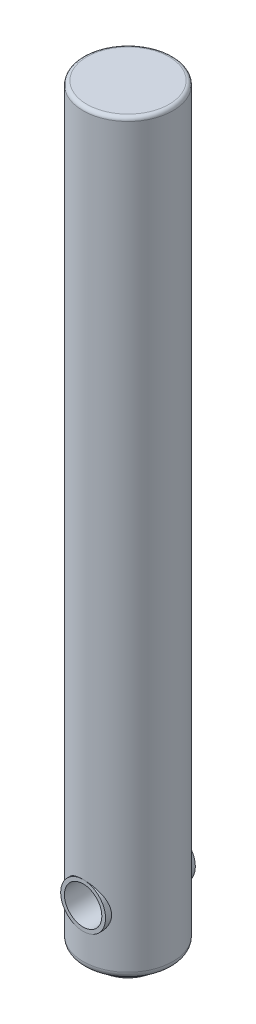
ISO-10303-21;
HEADER;
FILE_DESCRIPTION(('STEP AP214'),'2;1');
FILE_NAME('part.step','',(''),(''),'','','');
FILE_SCHEMA(('AUTOMOTIVE_DESIGN { 1 0 10303 214 1 1 1 1 }'));
ENDSEC;
DATA;
#1=APPLICATION_CONTEXT('core data for automotive mechanical design processes');
#2=APPLICATION_PROTOCOL_DEFINITION('international standard','automotive_design',2000,#1);
#3=PRODUCT_CONTEXT('',#1,'mechanical');
#4=PRODUCT('Part','Part','',(#3));
#5=PRODUCT_RELATED_PRODUCT_CATEGORY('part','',(#4));
#6=PRODUCT_DEFINITION_FORMATION('','',#4);
#7=PRODUCT_DEFINITION_CONTEXT('part definition',#1,'design');
#8=PRODUCT_DEFINITION('design','',#6,#7);
#9=PRODUCT_DEFINITION_SHAPE('','',#8);
#10=(LENGTH_UNIT() NAMED_UNIT(*) SI_UNIT(.MILLI.,.METRE.));
#11=(NAMED_UNIT(*) PLANE_ANGLE_UNIT() SI_UNIT($,.RADIAN.));
#12=(NAMED_UNIT(*) SI_UNIT($,.STERADIAN.) SOLID_ANGLE_UNIT());
#13=UNCERTAINTY_MEASURE_WITH_UNIT(LENGTH_MEASURE(1.E-05),#10,'distance_accuracy_value','');
#14=(GEOMETRIC_REPRESENTATION_CONTEXT(3) GLOBAL_UNCERTAINTY_ASSIGNED_CONTEXT((#13)) GLOBAL_UNIT_ASSIGNED_CONTEXT((#10,
#11,#12)) REPRESENTATION_CONTEXT('',''));
#15=CARTESIAN_POINT('',(0.,0.,0.));
#16=DIRECTION('',(0.,0.,1.));
#17=DIRECTION('',(1.,0.,0.));
#18=AXIS2_PLACEMENT_3D('',#15,#16,#17);
#19=CARTESIAN_POINT('',(0.,200.,0.));
#20=DIRECTION('',(0.,-1.,0.));
#21=DIRECTION('',(0.,0.,-1.));
#22=AXIS2_PLACEMENT_3D('',#19,#20,#21);
#23=CYLINDRICAL_SURFACE('',#22,12.);
#24=CARTESIAN_POINT('',(0.,199.,0.));
#25=DIRECTION('',(0.,1.,0.));
#26=DIRECTION('',(0.,0.,1.));
#27=AXIS2_PLACEMENT_3D('',#24,#25,#26);
#28=CIRCLE('',#27,12.);
#29=CARTESIAN_POINT('',(0.,199.,12.));
#30=VERTEX_POINT('',#29);
#31=EDGE_CURVE('E11',#30,#30,#28,.F.);
#32=ORIENTED_EDGE('',*,*,#31,.T.);
#33=EDGE_LOOP('',(#32));
#34=FACE_BOUND('',#33,.T.);
#35=CARTESIAN_POINT('',(0.,2.,0.));
#36=DIRECTION('',(0.,1.,0.));
#37=DIRECTION('',(0.,0.,1.));
#38=AXIS2_PLACEMENT_3D('',#35,#36,#37);
#39=CIRCLE('',#38,12.);
#40=CARTESIAN_POINT('',(0.,2.,12.));
#41=VERTEX_POINT('',#40);
#42=EDGE_CURVE('E118',#41,#41,#39,.T.);
#43=ORIENTED_EDGE('',*,*,#42,.T.);
#44=EDGE_LOOP('',(#43));
#45=FACE_BOUND('',#44,.T.);
#46=CARTESIAN_POINT('',(0.,21.,-12.));
#47=CARTESIAN_POINT('',(-0.15778665750659,20.9999994729223,-11.999999517333));
#48=CARTESIAN_POINT('',(-0.315584362390745,20.9937686657008,-11.9968806357414));
#49=CARTESIAN_POINT('',(-0.630017505488314,20.9689165310243,-11.9844837357367));
#50=CARTESIAN_POINT('',(-0.786652408091074,20.950289813296,-11.9752030379058));
#51=CARTESIAN_POINT('',(-1.09773984723465,20.9008310572039,-11.9507048014984));
#52=CARTESIAN_POINT('',(-1.25218894477724,20.869981612968,-11.9354787969095));
#53=CARTESIAN_POINT('',(-1.55763162669136,20.7964192186789,-11.899472605728));
#54=CARTESIAN_POINT('',(-1.70862377104804,20.753701418725,-11.8786901486704));
#55=CARTESIAN_POINT('',(-2.00545669311594,20.6570657258618,-11.8321851368608));
#56=CARTESIAN_POINT('',(-2.15131699081467,20.6031972673143,-11.8064844230278));
#57=CARTESIAN_POINT('',(-2.43773317125829,20.4846617971933,-11.7506932229282));
#58=CARTESIAN_POINT('',(-2.57828703310104,20.4199907214134,-11.7206010850419));
#59=CARTESIAN_POINT('',(-2.9906722413852,20.2106378016774,-11.6247696320651));
#60=CARTESIAN_POINT('',(-3.25355436812248,20.0505086372506,-11.5534217342428));
#61=CARTESIAN_POINT('',(-3.76508783734944,19.6828889706445,-11.3973719786279));
#62=CARTESIAN_POINT('',(-4.011916106714,19.4731192832976,-11.3121233680264));
#63=CARTESIAN_POINT('',(-4.46869184071481,19.0168329368505,-11.1395867857715));
#64=CARTESIAN_POINT('',(-4.67861120056694,18.7702885369187,-11.052297316888));
#65=CARTESIAN_POINT('',(-4.96965764340833,18.3664482319131,-10.9231409611172));
#66=CARTESIAN_POINT('',(-5.06557168476816,18.2203491833003,-10.8788710330199));
#67=CARTESIAN_POINT('',(-5.24464654593473,17.9196345353008,-10.7936784259666));
#68=CARTESIAN_POINT('',(-5.32781276827762,17.765022581661,-10.7527543324936));
#69=CARTESIAN_POINT('',(-5.48065335185335,17.4481396191338,-10.6756627859445));
#70=CARTESIAN_POINT('',(-5.55032854738167,17.2858690846313,-10.6394950387766));
#71=CARTESIAN_POINT('',(-5.67539334483848,16.9547874711191,-10.5733116591534));
#72=CARTESIAN_POINT('',(-5.73079140497155,16.7859803330947,-10.5432923863307));
#73=CARTESIAN_POINT('',(-5.82376390163365,16.4532113952768,-10.4922076496055));
#74=CARTESIAN_POINT('',(-5.86220067382683,16.289556147351,-10.4707166907288));
#75=CARTESIAN_POINT('',(-5.92527136019382,15.9588884400843,-10.4351557632392));
#76=CARTESIAN_POINT('',(-5.94991259763506,15.7918778107954,-10.4210818575664));
#77=CARTESIAN_POINT('',(-5.98502866078839,15.4559912401471,-10.4009539976217));
#78=CARTESIAN_POINT('',(-5.99551201814884,15.2871164840433,-10.3948952134206));
#79=CARTESIAN_POINT('',(-6.00216482773377,14.9489985368372,-10.3910555784398));
#80=CARTESIAN_POINT('',(-5.9983356456294,14.7797553824266,-10.3932739378732));
#81=CARTESIAN_POINT('',(-5.97774962961665,14.4627557239952,-10.4051247299039));
#82=CARTESIAN_POINT('',(-5.96259849844362,14.3148568796959,-10.4138359630376));
#83=CARTESIAN_POINT('',(-5.92145283395669,14.0210145401703,-10.4372868829351));
#84=CARTESIAN_POINT('',(-5.89545489495947,13.87507167395,-10.4520284630803));
#85=CARTESIAN_POINT('',(-5.83291533897245,13.5861625516483,-10.4870577551983));
#86=CARTESIAN_POINT('',(-5.796375023719,13.4431959304057,-10.5073447824221));
#87=CARTESIAN_POINT('',(-5.7131318300676,13.1610343474289,-10.5528368877399));
#88=CARTESIAN_POINT('',(-5.66642495833423,13.0218408919894,-10.5780438979576));
#89=CARTESIAN_POINT('',(-5.50930393619581,12.6047917542198,-10.6612323891138));
#90=CARTESIAN_POINT('',(-5.38330542988224,12.3339679727981,-10.7259455020169));
#91=CARTESIAN_POINT('',(-5.09423509206158,11.816147858089,-10.8662091969286));
#92=CARTESIAN_POINT('',(-4.93114660816762,11.5691622986771,-10.941764641208));
#93=CARTESIAN_POINT('',(-4.54841306771565,11.0728937661688,-11.1067854691139));
#94=CARTESIAN_POINT('',(-4.32421885971531,10.8272903907529,-11.19679985044));
#95=CARTESIAN_POINT('',(-3.83728133811826,10.3755558411719,-11.3728681669182));
#96=CARTESIAN_POINT('',(-3.57451970663576,10.1694435314215,-11.4589201944648));
#97=CARTESIAN_POINT('',(-3.1491672011915,9.88987092346063,-11.5804140789891));
#98=CARTESIAN_POINT('',(-2.99845202805221,9.79997748581405,-11.620444563298));
#99=CARTESIAN_POINT('',(-2.68885272169301,9.63335015644472,-11.6959566326146));
#100=CARTESIAN_POINT('',(-2.52997206899903,9.55661071733304,-11.7314401336039));
#101=CARTESIAN_POINT('',(-2.20515363984366,9.4171213494976,-11.796810642152));
#102=CARTESIAN_POINT('',(-2.03921873643215,9.35436578921243,-11.826699901834));
#103=CARTESIAN_POINT('',(-1.70149425450703,9.24357008526185,-11.8799883173954));
#104=CARTESIAN_POINT('',(-1.52970535202999,9.19552824877026,-11.9033882198513));
#105=CARTESIAN_POINT('',(-1.19615761935544,9.11815972325563,-11.9413151682626));
#106=CARTESIAN_POINT('',(-1.0347464118509,9.08761257957787,-11.956416557175));
#107=CARTESIAN_POINT('',(-0.709498028988244,9.03983035246897,-11.980116427625));
#108=CARTESIAN_POINT('',(-0.545661069388974,9.02259409226307,-11.9887154840127));
#109=CARTESIAN_POINT('',(-0.216972862468056,9.00166419835052,-11.9991645701724));
#110=CARTESIAN_POINT('',(-0.0521220276819344,8.99796537998723,-12.0010171837393));
#111=CARTESIAN_POINT('',(0.277257172214853,9.00414671559377,-11.9979268381775));
#112=CARTESIAN_POINT('',(0.441785551273996,9.01402626861392,-11.992984179793));
#113=CARTESIAN_POINT('',(0.756388684583027,9.04593431607277,-11.9770917324992));
#114=CARTESIAN_POINT('',(0.906591982753162,9.06695772022474,-11.9666392666057));
#115=CARTESIAN_POINT('',(1.20456563233119,9.12020970134662,-11.9403265284468));
#116=CARTESIAN_POINT('',(1.35233519758663,9.15244182742274,-11.9244645433534));
#117=CARTESIAN_POINT('',(1.64438575428244,9.22776198072708,-11.8877101482599));
#118=CARTESIAN_POINT('',(1.78866779847568,9.27084668595717,-11.8668192776993));
#119=CARTESIAN_POINT('',(2.07298257233464,9.36747841901584,-11.8204696431794));
#120=CARTESIAN_POINT('',(2.21301365040652,9.42102945463087,-11.7950091297101));
#121=CARTESIAN_POINT('',(2.49189624030328,9.53977490960353,-11.7393028015628));
#122=CARTESIAN_POINT('',(2.63060339081931,9.60525483857787,-11.7089423848929));
#123=CARTESIAN_POINT('',(2.90198094402243,9.74624711719641,-11.6446549954643));
#124=CARTESIAN_POINT('',(3.03464912246201,9.82176312378188,-11.6107267235974));
#125=CARTESIAN_POINT('',(3.42262651921551,10.0625741696082,-11.5046658949123));
#126=CARTESIAN_POINT('',(3.66805794640021,10.2421963229906,-11.4282262974126));
#127=CARTESIAN_POINT('',(4.15064329035224,10.654571869757,-11.2624878293664));
#128=CARTESIAN_POINT('',(4.3846175451149,10.8908106291793,-11.1726633057385));
#129=CARTESIAN_POINT('',(4.81115285762436,11.3995975205787,-10.9957332695664));
#130=CARTESIAN_POINT('',(5.0036852666756,11.6721705609547,-10.9086296733302));
#131=CARTESIAN_POINT('',(5.26159500383475,12.1109915972481,-10.7854222397218));
#132=CARTESIAN_POINT('',(5.34392396170295,12.266225787631,-10.7447501998903));
#133=CARTESIAN_POINT('',(5.49501896116917,12.584277503554,-10.6682672504455));
#134=CARTESIAN_POINT('',(5.56379154045446,12.7470913266846,-10.632454000247));
#135=CARTESIAN_POINT('',(5.68696809582943,13.0791324916116,-10.5670839096235));
#136=CARTESIAN_POINT('',(5.74138360588706,13.2483545594889,-10.5375220508625));
#137=CARTESIAN_POINT('',(5.83518002342334,13.5920292388028,-10.4858738342513));
#138=CARTESIAN_POINT('',(5.87456325877644,13.7664810358553,-10.4637863189961));
#139=CARTESIAN_POINT('',(5.93464549962821,14.1021150485129,-10.4298156032619));
#140=CARTESIAN_POINT('',(5.95677515741596,14.2629635377784,-10.4171563888611));
#141=CARTESIAN_POINT('',(5.98792614324689,14.5863363106116,-10.399282087544));
#142=CARTESIAN_POINT('',(5.99694836276266,14.7488604794546,-10.3940664943671));
#143=CARTESIAN_POINT('',(6.0017457309024,15.0741083106821,-10.39129710714));
#144=CARTESIAN_POINT('',(5.99752577925852,15.2368318770154,-10.3937404791976));
#145=CARTESIAN_POINT('',(5.97591568312032,15.5611026735415,-10.4061801831484));
#146=CARTESIAN_POINT('',(5.95852607778567,15.7226499516177,-10.4161762058393));
#147=CARTESIAN_POINT('',(5.91311736162768,16.0278705738329,-10.4420137994047));
#148=CARTESIAN_POINT('',(5.8862738904068,16.1717757337559,-10.4572048845609));
#149=CARTESIAN_POINT('',(5.82233328291582,16.4566302618556,-10.4929387440244));
#150=CARTESIAN_POINT('',(5.78523274221134,16.5975786319006,-10.5134832950758));
#151=CARTESIAN_POINT('',(5.65908430450414,17.0147001559654,-10.5822506400165));
#152=CARTESIAN_POINT('',(5.55515995912644,17.2853452149275,-10.6376249866544));
#153=CARTESIAN_POINT('',(5.30288229290565,17.8237946508565,-10.7657155223649));
#154=CARTESIAN_POINT('',(5.15201309583076,18.0901865172672,-10.8393468768705));
#155=CARTESIAN_POINT('',(4.81291956804656,18.5956281008334,-10.9941163631343));
#156=CARTESIAN_POINT('',(4.62467580306306,18.8346634906172,-11.0752583885738));
#157=CARTESIAN_POINT('',(4.18917198682791,19.3088865402848,-11.2477510970766));
#158=CARTESIAN_POINT('',(3.93752026690748,19.5400775742369,-11.3391442276818));
#159=CARTESIAN_POINT('',(3.53209733214223,19.8532025669049,-11.4692892104779));
#160=CARTESIAN_POINT('',(3.39216916282729,19.9520363073581,-11.5115460678003));
#161=CARTESIAN_POINT('',(3.10368746347901,20.137752923716,-11.5926493680118));
#162=CARTESIAN_POINT('',(2.95513790564797,20.2246412421351,-11.6314973610929));
#163=CARTESIAN_POINT('',(2.64908199116111,20.3863304962342,-11.705013109218));
#164=CARTESIAN_POINT('',(2.49151563532489,20.4610335306701,-11.739646488167));
#165=CARTESIAN_POINT('',(2.16958487964698,20.5967303484265,-11.8033809723761));
#166=CARTESIAN_POINT('',(2.00522386671555,20.6577308667177,-11.8324847943983));
#167=CARTESIAN_POINT('',(1.67123654305269,20.7652126680381,-11.8842527340049));
#168=CARTESIAN_POINT('',(1.50162261994211,20.8117256182699,-11.906930886991));
#169=CARTESIAN_POINT('',(1.15828397558868,20.8897656085357,-11.945215702731));
#170=CARTESIAN_POINT('',(0.984561833748138,20.9213018027539,-11.9608266848506));
#171=CARTESIAN_POINT('',(0.675650105814743,20.9633693498498,-11.9817166032964));
#172=CARTESIAN_POINT('',(0.540991004079837,20.9770940804863,-11.9885608853928));
#173=CARTESIAN_POINT('',(0.270890662855613,20.995409757845,-11.9977028536597));
#174=CARTESIAN_POINT('',(0.135449401881627,21.0000004524614,-12.0000004143376));
#175=CARTESIAN_POINT('',(0.,21.,-12.));
#176=B_SPLINE_CURVE_WITH_KNOTS('',3,(#46,#47,#48,#49,#50,#51,#52,#53,#54,#55,#56,#57,#58,#59,
#60,#61,#62,#63,#64,#65,#66,#67,#68,#69,#70,#71,#72,#73,#74,#75,#76,#77,#78,#79,#80,#81,#82,#83,
#84,#85,#86,#87,#88,#89,#90,#91,#92,#93,#94,#95,#96,#97,#98,#99,#100,#101,#102,#103,#104,#105,
#106,#107,#108,#109,#110,#111,#112,#113,#114,#115,#116,#117,#118,#119,#120,#121,#122,#123,#124,
#125,#126,#127,#128,#129,#130,#131,#132,#133,#134,#135,#136,#137,#138,#139,#140,#141,#142,#143,
#144,#145,#146,#147,#148,#149,#150,#151,#152,#153,#154,#155,#156,#157,#158,#159,#160,#161,#162,
#163,#164,#165,#166,#167,#168,#169,#170,#171,#172,#173,#174,#175),.UNSPECIFIED.,.T.,.F.,(4,2,2,
2,2,2,2,2,2,2,2,2,2,2,2,2,2,2,2,2,2,2,2,2,2,2,2,2,2,2,2,2,2,2,2,2,2,2,2,2,2,2,2,2,2,2,2,2,2,2,2,
2,2,2,2,2,2,2,2,2,2,2,2,2,4),(0.,0.473226353579866,0.946658620845379,1.42076752042832,
1.89507044618031,2.36731402236651,2.83973566985558,3.78354530039119,4.78445328921032,
5.786120162826,6.32642118596971,6.86649259220192,7.40653058932848,7.94624791240663,
8.45395033294239,8.96138298687526,9.46850972130813,9.97558806805501,10.4218446882245,
10.868241529725,11.3145832752512,11.7611006573465,12.674026831915,13.5873636974191,
14.6165089018385,15.646144497727,16.1855259709471,16.724679410078,17.2636153283551,
17.8024892182932,18.2967339523968,18.7909349868218,19.2849467291347,19.7789366082479,
20.2344903466114,20.6901884620942,21.1457472565439,21.6014808373907,22.0700530070643,
22.5387963853797,23.4757920686062,24.5048016623547,25.5345203406166,26.0749950935823,
26.6152085565286,27.1549867002174,27.6946812207644,28.1825688461441,28.6704232874037,
29.1580972390615,29.6457512266466,30.0867670068204,30.5279293410885,31.4096652534582,
32.3506409329744,33.292107194775,34.3479680915645,34.8767898811921,35.4053699274536,
35.9380073127865,36.4703823240418,37.0015853583519,37.5324632882878,37.9386855790538,
38.3449190816828),.UNSPECIFIED.);
#177=CARTESIAN_POINT('',(0.,9.,-12.));
#178=VERTEX_POINT('',#177);
#179=CARTESIAN_POINT('',(0.,21.,-12.));
#180=VERTEX_POINT('',#179);
#181=EDGE_CURVE('E78',#178,#180,#176,.T.);
#182=ORIENTED_EDGE('',*,*,#181,.T.);
#183=EDGE_CURVE('E80',#180,#178,#176,.T.);
#184=ORIENTED_EDGE('',*,*,#183,.T.);
#185=EDGE_LOOP('',(#182,#184));
#186=FACE_BOUND('',#185,.T.);
#187=CARTESIAN_POINT('',(6.,15.,10.3923048454133));
#188=CARTESIAN_POINT('',(5.99999932875804,14.8436021552913,10.392305741369));
#189=CARTESIAN_POINT('',(5.99387675624553,14.6871906948031,10.39584745739));
#190=CARTESIAN_POINT('',(5.96946677329013,14.3755731530049,10.4098828015151));
#191=CARTESIAN_POINT('',(5.95117369948805,14.2203676669088,10.4203796660835));
#192=CARTESIAN_POINT('',(5.90262923828191,13.9121859557094,10.447954141523));
#193=CARTESIAN_POINT('',(5.8723590974293,13.7592136185881,10.4650420714895));
#194=CARTESIAN_POINT('',(5.80022662043492,13.4567708159041,10.5051926116526));
#195=CARTESIAN_POINT('',(5.75835924341967,13.3073019038577,10.5282578196609));
#196=CARTESIAN_POINT('',(5.663772314443,13.0137156916186,10.5794400850423));
#197=CARTESIAN_POINT('',(5.61111714169721,12.8695723712196,10.607527052553));
#198=CARTESIAN_POINT('',(5.49530086331669,12.5864779020686,10.6679865511427));
#199=CARTESIAN_POINT('',(5.4321356919844,12.447528788222,10.7003607397011));
#200=CARTESIAN_POINT('',(5.22766532232496,12.0396108510837,10.802532596744));
#201=CARTESIAN_POINT('',(5.07129480406256,11.7792936359453,10.8774308638826));
#202=CARTESIAN_POINT('',(4.70799231550122,11.2661256446182,11.0398177990442));
#203=CARTESIAN_POINT('',(4.49795386813279,11.0156615224013,11.1278353936549));
#204=CARTESIAN_POINT('',(4.03948117371046,10.5515333249958,11.3023273959528));
#205=CARTESIAN_POINT('',(3.79102789078169,10.3378876061909,11.3888010147197));
#206=CARTESIAN_POINT('',(3.38439787953913,10.0425266354713,11.5138135690253));
#207=CARTESIAN_POINT('',(3.23805814579229,9.94570377541614,11.5559227213337));
#208=CARTESIAN_POINT('',(2.93666573459215,9.76484604338099,11.6361618128117));
#209=CARTESIAN_POINT('',(2.78161655887156,9.68080608157111,11.6742933338641));
#210=CARTESIAN_POINT('',(2.46380865861872,9.52634840407236,11.7454742632684));
#211=CARTESIAN_POINT('',(2.30105193358389,9.45592717924081,11.7785249803407));
#212=CARTESIAN_POINT('',(1.96895637505893,9.32948281278635,11.838566903458));
#213=CARTESIAN_POINT('',(1.79961824290214,9.27345814184267,11.8655587530874));
#214=CARTESIAN_POINT('',(1.46796523734072,9.17998137683781,11.910964320852));
#215=CARTESIAN_POINT('',(1.30600725038547,9.14149186449492,11.9298515503274));
#216=CARTESIAN_POINT('',(0.978851024052966,9.07804028965359,11.9611388575223));
#217=CARTESIAN_POINT('',(0.813653101774464,9.0530769101049,11.9735395668353));
#218=CARTESIAN_POINT('',(0.481460478739201,9.01701609852606,11.9914908073716));
#219=CARTESIAN_POINT('',(0.314466684612793,9.00591197331588,11.9970446452029));
#220=CARTESIAN_POINT('',(-0.0199464948389185,8.99770282703309,12.0011481588105));
#221=CARTESIAN_POINT('',(-0.187365853499544,9.00059694947556,11.9996982631112));
#222=CARTESIAN_POINT('',(-0.506589791633968,9.01947663166479,11.9902712137001));
#223=CARTESIAN_POINT('',(-0.658482134439481,9.03429779604867,11.9828746683771));
#224=CARTESIAN_POINT('',(-0.960375366803328,9.07539941588175,11.9624651786912));
#225=CARTESIAN_POINT('',(-1.11037564373809,9.10168348958687,11.9494504609709));
#226=CARTESIAN_POINT('',(-1.40736231676571,9.16541424516195,11.9181215892033));
#227=CARTESIAN_POINT('',(-1.55434970349899,9.20285719295813,11.8998092079635));
#228=CARTESIAN_POINT('',(-1.84448858454545,9.28854174964669,11.8583030549934));
#229=CARTESIAN_POINT('',(-1.98763858605639,9.33678749464534,11.8351074137955));
#230=CARTESIAN_POINT('',(-2.27111450437209,9.44434331009566,11.7840167356288));
#231=CARTESIAN_POINT('',(-2.41137687302084,9.50379298156608,11.7560628909047));
#232=CARTESIAN_POINT('',(-2.68633468157944,9.63281266278877,11.6963002508539));
#233=CARTESIAN_POINT('',(-2.82102808732155,9.70238632930676,11.66449006332));
#234=CARTESIAN_POINT('',(-3.215717269355,9.92551611770222,11.5642835494733));
#235=CARTESIAN_POINT('',(-3.4664938099295,10.0935467787595,11.491079046886));
#236=CARTESIAN_POINT('',(-3.96107927027503,10.481380428758,11.3306592010884));
#237=CARTESIAN_POINT('',(-4.20198876320848,10.7045758950342,11.2427735632043));
#238=CARTESIAN_POINT('',(-4.64464192012283,11.1875806565371,11.0672494208981));
#239=CARTESIAN_POINT('',(-4.84635545016497,11.4474178592508,10.9796111572661));
#240=CARTESIAN_POINT('',(-5.12154774655431,11.8694351015125,10.852690034615));
#241=CARTESIAN_POINT('',(-5.21088428973708,12.0204658464735,10.809958375918));
#242=CARTESIAN_POINT('',(-5.37636197172776,12.3306212817713,10.7286167072774));
#243=CARTESIAN_POINT('',(-5.45250906301565,12.4897422787665,10.6900048410833));
#244=CARTESIAN_POINT('',(-5.5908133671667,12.815044232353,10.6183275599361));
#245=CARTESIAN_POINT('',(-5.65297884201358,12.9812209502077,10.5852588723792));
#246=CARTESIAN_POINT('',(-5.76261014613384,13.3195456078321,10.5259781367613));
#247=CARTESIAN_POINT('',(-5.81007797978623,13.4916927298289,10.4997651538349));
#248=CARTESIAN_POINT('',(-5.8864684588798,13.8267029976813,10.4571147278771));
#249=CARTESIAN_POINT('',(-5.91656209992104,13.9892216740758,10.440067504375));
#250=CARTESIAN_POINT('',(-5.96327046880811,14.316795403977,10.413459251139));
#251=CARTESIAN_POINT('',(-5.9798859583574,14.4818503136139,10.4038977983557));
#252=CARTESIAN_POINT('',(-5.99937433144135,14.8129384288164,10.3926721810429));
#253=CARTESIAN_POINT('',(-6.00225551736758,14.9789709825969,10.3910032454886));
#254=CARTESIAN_POINT('',(-5.9942505125996,15.3105857019565,10.3956232987491));
#255=CARTESIAN_POINT('',(-5.98336525119572,15.4761678971804,10.4019117504082));
#256=CARTESIAN_POINT('',(-5.94994827834779,15.787301980084,10.4210572018758));
#257=CARTESIAN_POINT('',(-5.92882610394806,15.9330574839704,10.4331174310252));
#258=CARTESIAN_POINT('',(-5.8760573890982,16.222105089621,10.462928264834));
#259=CARTESIAN_POINT('',(-5.84440736800472,16.3653963601781,10.4806807513579));
#260=CARTESIAN_POINT('',(-5.77092581907105,16.6485769237038,10.5213199871667));
#261=CARTESIAN_POINT('',(-5.72909561584442,16.7884666566673,10.544206068454));
#262=CARTESIAN_POINT('',(-5.63565081247763,17.0641348853454,10.5944442815327));
#263=CARTESIAN_POINT('',(-5.58403239383497,17.1999117525268,10.6217981556852));
#264=CARTESIAN_POINT('',(-5.40993804625312,17.6123074312319,10.7121521369808));
#265=CARTESIAN_POINT('',(-5.27158161244914,17.8810294242147,10.7814923411515));
#266=CARTESIAN_POINT('',(-4.95770514493384,18.3928603291351,10.9293734264859));
#267=CARTESIAN_POINT('',(-4.78216602029863,18.6359559872004,11.0079190247385));
#268=CARTESIAN_POINT('',(-4.37304147690561,19.1218521941347,11.1772756019886));
#269=CARTESIAN_POINT('',(-4.13492832689387,19.3607527939218,11.2683846156907));
#270=CARTESIAN_POINT('',(-3.62037026027194,19.7965035484973,11.4440644757376));
#271=CARTESIAN_POINT('',(-3.3439124473918,19.9933394990643,11.5286331074208));
#272=CARTESIAN_POINT('',(-2.90128902413955,20.2548109295789,11.6450329745198));
#273=CARTESIAN_POINT('',(-2.74684527426439,20.3371944022749,11.6825150424328));
#274=CARTESIAN_POINT('',(-2.43042899314924,20.4885079397363,11.7524125489583));
#275=CARTESIAN_POINT('',(-2.26845983606525,20.5574439631985,11.7848302303761));
#276=CARTESIAN_POINT('',(-1.9382010590301,20.681061459194,11.8436272770892));
#277=CARTESIAN_POINT('',(-1.76991449786854,20.7357497309686,11.8700095218501));
#278=CARTESIAN_POINT('',(-1.42829668012573,20.8302108977189,11.9159410638554));
#279=CARTESIAN_POINT('',(-1.2549660243803,20.8699855613809,11.9354911713417));
#280=CARTESIAN_POINT('',(-0.920881742941758,20.9311140448501,11.9656791859913));
#281=CARTESIAN_POINT('',(-0.760433964929966,20.9538235457107,11.9769704022468));
#282=CARTESIAN_POINT('',(-0.437909004756085,20.9861921212794,11.9930937221647));
#283=CARTESIAN_POINT('',(-0.275831949461251,20.9958522042994,11.9979263248755));
#284=CARTESIAN_POINT('',(0.0485855862731747,21.0019958982416,12.0009977987531));
#285=CARTESIAN_POINT('',(0.210925976297035,20.9984833439568,11.9992385889158));
#286=CARTESIAN_POINT('',(0.534582899826924,20.9783366227843,11.9891797940407));
#287=CARTESIAN_POINT('',(0.695899461395649,20.9617028171238,11.980880389054));
#288=CARTESIAN_POINT('',(1.00560292006947,20.9170598996775,11.9587311661666));
#289=CARTESIAN_POINT('',(1.15413886135335,20.8898766322713,11.945285109477));
#290=CARTESIAN_POINT('',(1.44825211274634,20.8245401787259,11.9132052288127));
#291=CARTESIAN_POINT('',(1.59382846489179,20.786383499374,11.894569752928));
#292=CARTESIAN_POINT('',(1.8810400229358,20.6994899545833,11.8525414188178));
#293=CARTESIAN_POINT('',(2.02267631352901,20.6507560342275,11.8291498849635));
#294=CARTESIAN_POINT('',(2.30127410623528,20.5431464484512,11.7781255360154));
#295=CARTESIAN_POINT('',(2.43823379515633,20.4842669017263,11.7504910982014));
#296=CARTESIAN_POINT('',(2.85237786738682,20.2876984117346,11.6595788128095));
#297=CARTESIAN_POINT('',(3.12070571984021,20.1337434112259,11.5901238758717));
#298=CARTESIAN_POINT('',(3.6286930080142,19.7882330554684,11.4412811414165));
#299=CARTESIAN_POINT('',(3.86833919483505,19.5966604306096,11.3618887878928));
#300=CARTESIAN_POINT('',(4.33746428817372,19.1592355000293,11.1917214576535));
#301=CARTESIAN_POINT('',(4.56355782422281,18.9098786566224,11.1006000033316));
#302=CARTESIAN_POINT('',(4.97200803228961,18.3752420445469,10.9237724965179));
#303=CARTESIAN_POINT('',(5.1543260100608,18.0899308321081,10.8380712840253));
#304=CARTESIAN_POINT('',(5.39331084607992,17.6349365445585,10.7200955462233));
#305=CARTESIAN_POINT('',(5.46810808240356,17.4760484451297,10.6820243958783));
#306=CARTESIAN_POINT('',(5.60382523796708,17.1512934045194,10.6114556521985));
#307=CARTESIAN_POINT('',(5.66475230453968,16.9854301101164,10.5789551904174));
#308=CARTESIAN_POINT('',(5.77185247512189,16.6483105621503,10.5209043137719));
#309=CARTESIAN_POINT('',(5.81806353488239,16.4770694546864,10.4953360450528));
#310=CARTESIAN_POINT('',(5.89524853915343,16.1302894202508,10.4521774176137));
#311=CARTESIAN_POINT('',(5.92623313691241,15.9547535886251,10.434581481697));
#312=CARTESIAN_POINT('',(5.96618770024637,15.6492025460488,10.4117704898707));
#313=CARTESIAN_POINT('',(5.97885517465766,15.5198109729582,10.4044886216277));
#314=CARTESIAN_POINT('',(5.99576188573605,15.260282775589,10.3947552650442));
#315=CARTESIAN_POINT('',(6.00000055857243,15.1301461020521,10.3923040998458));
#316=CARTESIAN_POINT('',(6.,15.,10.3923048454133));
#317=B_SPLINE_CURVE_WITH_KNOTS('',3,(#187,#188,#189,#190,#191,#192,#193,#194,#195,#196,#197,
#198,#199,#200,#201,#202,#203,#204,#205,#206,#207,#208,#209,#210,#211,#212,#213,#214,#215,#216,
#217,#218,#219,#220,#221,#222,#223,#224,#225,#226,#227,#228,#229,#230,#231,#232,#233,#234,#235,
#236,#237,#238,#239,#240,#241,#242,#243,#244,#245,#246,#247,#248,#249,#250,#251,#252,#253,#254,
#255,#256,#257,#258,#259,#260,#261,#262,#263,#264,#265,#266,#267,#268,#269,#270,#271,#272,#273,
#274,#275,#276,#277,#278,#279,#280,#281,#282,#283,#284,#285,#286,#287,#288,#289,#290,#291,#292,
#293,#294,#295,#296,#297,#298,#299,#300,#301,#302,#303,#304,#305,#306,#307,#308,#309,#310,#311,
#312,#313,#314,#315,#316),.UNSPECIFIED.,.T.,.F.,(4,2,2,2,2,2,2,2,2,2,2,2,2,2,2,2,2,2,2,2,2,2,2,
2,2,2,2,2,2,2,2,2,2,2,2,2,2,2,2,2,2,2,2,2,2,2,2,2,2,2,2,2,2,2,2,2,2,2,2,2,2,2,2,2,4),(0.,
0.469058861467784,0.938336145208527,1.40835114013877,1.87857075399762,2.34606192528538,
2.81373436354148,3.74819914074976,4.75973666306827,5.77177705314113,6.31254530021907,
6.85309766007109,7.39351054956331,7.9338660081849,8.43579584804104,8.93767680580506,
9.43931529157654,9.94092308490932,10.3987605893829,10.8567427145252,11.3145717576894,
11.7725763921741,12.2367183854899,12.7010284439794,13.6290943211269,14.6448878475107,
15.6614592548481,16.2026787801496,16.7436534097354,17.2843075230363,17.8248878725594,
18.3226559583315,18.8203959113072,19.317834942111,19.8152403955801,20.2580476093189,
20.7010013666459,21.1438975189972,21.5869668073351,22.5132614455366,23.4400328343742,
24.4836282760081,25.5275755598635,26.0639955466663,26.6001772978731,27.1361027044388,
27.6719645325613,28.1586420415303,28.6452819433933,29.1317801865704,29.6182650369473,
30.072548085153,30.5269759075856,30.9812773629768,31.4357530030728,32.3826620355203,
33.3300067983952,34.3716315033561,35.4141735630613,35.9526248370357,36.4907980144954,
37.027571669005,37.5639692313149,37.9542693623306,38.3445956009481),.UNSPECIFIED.);
#318=CARTESIAN_POINT('',(0.,21.,12.));
#319=VERTEX_POINT('',#318);
#320=CARTESIAN_POINT('',(0.,9.,12.));
#321=VERTEX_POINT('',#320);
#322=EDGE_CURVE('E64',#319,#321,#317,.T.);
#323=ORIENTED_EDGE('',*,*,#322,.T.);
#324=EDGE_CURVE('E70',#321,#319,#317,.T.);
#325=ORIENTED_EDGE('',*,*,#324,.T.);
#326=EDGE_LOOP('',(#323,#325));
#327=FACE_BOUND('',#326,.T.);
#328=ADVANCED_FACE('F33',(#34,#45,#186,#327),#23,.T.);
#329=CARTESIAN_POINT('',(0.,200.,0.));
#330=DIRECTION('',(0.,1.,0.));
#331=DIRECTION('',(0.,0.,1.));
#332=AXIS2_PLACEMENT_3D('',#329,#330,#331);
#333=PLANE('',#332);
#334=CARTESIAN_POINT('',(0.,200.,0.));
#335=DIRECTION('',(0.,1.,0.));
#336=DIRECTION('',(0.,0.,1.));
#337=AXIS2_PLACEMENT_3D('',#334,#335,#336);
#338=CIRCLE('',#337,11.);
#339=CARTESIAN_POINT('',(0.,200.,11.));
#340=VERTEX_POINT('',#339);
#341=EDGE_CURVE('E42',#340,#340,#338,.T.);
#342=ORIENTED_EDGE('',*,*,#341,.T.);
#343=EDGE_LOOP('',(#342));
#344=FACE_BOUND('',#343,.T.);
#345=ADVANCED_FACE('F102',(#344),#333,.T.);
#346=CARTESIAN_POINT('',(0.,7.50000000000001,0.));
#347=DIRECTION('',(0.,0.,1.));
#348=DIRECTION('',(1.,0.,0.));
#349=AXIS2_PLACEMENT_3D('',#346,#347,#348);
#350=SPHERICAL_SURFACE('',#349,12.5);
#351=CARTESIAN_POINT('',(0.,7.50000000000001,0.));
#352=DIRECTION('',(0.,1.,0.));
#353=DIRECTION('',(0.,0.,1.));
#354=AXIS2_PLACEMENT_3D('',#351,#352,#353);
#355=SPHERICAL_SURFACE('',#354,12.5);
#356=CARTESIAN_POINT('',(0.,0.,0.));
#357=DIRECTION('',(0.,1.,0.));
#358=DIRECTION('',(0.,0.,1.));
#359=AXIS2_PLACEMENT_3D('',#356,#357,#358);
#360=CIRCLE('',#359,10.);
#361=CARTESIAN_POINT('',(0.,0.,10.));
#362=VERTEX_POINT('',#361);
#363=EDGE_CURVE('E37',#362,#362,#360,.F.);
#364=ORIENTED_EDGE('',*,*,#363,.T.);
#365=EDGE_LOOP('',(#364));
#366=FACE_BOUND('',#365,.T.);
#367=ADVANCED_FACE('F35',(#366),#355,.T.);
#368=CARTESIAN_POINT('',(0.,15.,-12.));
#369=DIRECTION('',(0.,0.,1.));
#370=DIRECTION('',(1.,0.,0.));
#371=AXIS2_PLACEMENT_3D('',#368,#369,#370);
#372=CYLINDRICAL_SURFACE('',#371,6.);
#373=ORIENTED_EDGE('',*,*,#322,.F.);
#374=CARTESIAN_POINT('',(0.,15.,12.));
#375=DIRECTION('',(0.,0.,1.));
#376=DIRECTION('',(1.,0.,0.));
#377=AXIS2_PLACEMENT_3D('',#374,#375,#376);
#378=CIRCLE('',#377,6.);
#379=EDGE_CURVE('E66',#321,#319,#378,.T.);
#380=ORIENTED_EDGE('',*,*,#379,.F.);
#381=EDGE_LOOP('',(#373,#380));
#382=FACE_BOUND('',#381,.T.);
#383=ADVANCED_FACE('F65',(#382),#372,.T.);
#384=CARTESIAN_POINT('',(0.,15.,12.));
#385=DIRECTION('',(0.,0.,1.));
#386=DIRECTION('',(1.,0.,0.));
#387=AXIS2_PLACEMENT_3D('',#384,#385,#386);
#388=PLANE('',#387);
#389=CARTESIAN_POINT('',(0.,15.,12.));
#390=DIRECTION('',(0.,0.,1.));
#391=DIRECTION('',(1.,0.,0.));
#392=AXIS2_PLACEMENT_3D('',#389,#390,#391);
#393=CIRCLE('',#392,5.);
#394=CARTESIAN_POINT('',(5.,15.,12.));
#395=VERTEX_POINT('',#394);
#396=EDGE_CURVE('E128',#395,#395,#393,.T.);
#397=ORIENTED_EDGE('',*,*,#396,.F.);
#398=EDGE_LOOP('',(#397));
#399=FACE_BOUND('',#398,.T.);
#400=EDGE_CURVE('E55',#319,#321,#378,.T.);
#401=ORIENTED_EDGE('',*,*,#400,.T.);
#402=ORIENTED_EDGE('',*,*,#379,.T.);
#403=EDGE_LOOP('',(#401,#402));
#404=FACE_BOUND('',#403,.T.);
#405=ADVANCED_FACE('F72',(#399,#404),#388,.T.);
#406=ORIENTED_EDGE('',*,*,#324,.F.);
#407=ORIENTED_EDGE('',*,*,#400,.F.);
#408=EDGE_LOOP('',(#406,#407));
#409=FACE_BOUND('',#408,.T.);
#410=ADVANCED_FACE('F76',(#409),#372,.T.);
#411=ORIENTED_EDGE('',*,*,#183,.F.);
#412=CARTESIAN_POINT('',(0.,15.,-12.));
#413=DIRECTION('',(0.,0.,1.));
#414=DIRECTION('',(1.,0.,0.));
#415=AXIS2_PLACEMENT_3D('',#412,#413,#414);
#416=CIRCLE('',#415,6.);
#417=EDGE_CURVE('E48',#180,#178,#416,.T.);
#418=ORIENTED_EDGE('',*,*,#417,.T.);
#419=EDGE_LOOP('',(#411,#418));
#420=FACE_BOUND('',#419,.T.);
#421=ADVANCED_FACE('F95',(#420),#372,.T.);
#422=ORIENTED_EDGE('',*,*,#181,.F.);
#423=EDGE_CURVE('E77',#178,#180,#416,.T.);
#424=ORIENTED_EDGE('',*,*,#423,.T.);
#425=EDGE_LOOP('',(#422,#424));
#426=FACE_BOUND('',#425,.T.);
#427=ADVANCED_FACE('F99',(#426),#372,.T.);
#428=CARTESIAN_POINT('',(0.,15.,-12.));
#429=DIRECTION('',(0.,0.,1.));
#430=DIRECTION('',(1.,0.,0.));
#431=AXIS2_PLACEMENT_3D('',#428,#429,#430);
#432=PLANE('',#431);
#433=CARTESIAN_POINT('',(0.,15.,-12.));
#434=DIRECTION('',(0.,0.,1.));
#435=DIRECTION('',(1.,0.,0.));
#436=AXIS2_PLACEMENT_3D('',#433,#434,#435);
#437=CIRCLE('',#436,5.);
#438=CARTESIAN_POINT('',(5.,15.,-12.));
#439=VERTEX_POINT('',#438);
#440=EDGE_CURVE('E73',#439,#439,#437,.F.);
#441=ORIENTED_EDGE('',*,*,#440,.F.);
#442=EDGE_LOOP('',(#441));
#443=FACE_BOUND('',#442,.T.);
#444=ORIENTED_EDGE('',*,*,#417,.F.);
#445=ORIENTED_EDGE('',*,*,#423,.F.);
#446=EDGE_LOOP('',(#444,#445));
#447=FACE_BOUND('',#446,.T.);
#448=ADVANCED_FACE('F167',(#443,#447),#432,.F.);
#449=CARTESIAN_POINT('',(0.,15.,-12.001));
#450=DIRECTION('',(0.,0.,1.));
#451=DIRECTION('',(1.,0.,0.));
#452=AXIS2_PLACEMENT_3D('',#449,#450,#451);
#453=CYLINDRICAL_SURFACE('',#452,5.);
#454=CARTESIAN_POINT('',(5.,15.,12.));
#455=CARTESIAN_POINT('',(5.,15.,11.75));
#456=CARTESIAN_POINT('',(5.,15.,11.5));
#457=CARTESIAN_POINT('',(5.,15.,11.));
#458=CARTESIAN_POINT('',(5.,15.,10.75));
#459=CARTESIAN_POINT('',(5.,15.,10.25));
#460=CARTESIAN_POINT('',(5.,15.,9.99999999999999));
#461=CARTESIAN_POINT('',(5.,15.,9.5));
#462=CARTESIAN_POINT('',(5.,15.,9.25));
#463=CARTESIAN_POINT('',(5.,15.,8.75));
#464=CARTESIAN_POINT('',(5.,15.,8.5));
#465=CARTESIAN_POINT('',(5.,15.,8.));
#466=CARTESIAN_POINT('',(5.,15.,7.75));
#467=CARTESIAN_POINT('',(5.,15.,7.25));
#468=CARTESIAN_POINT('',(5.,15.,7.));
#469=CARTESIAN_POINT('',(5.,15.,6.5));
#470=CARTESIAN_POINT('',(5.,15.,6.25));
#471=CARTESIAN_POINT('',(5.,15.,5.75));
#472=CARTESIAN_POINT('',(5.,15.,5.5));
#473=CARTESIAN_POINT('',(5.,15.,5.));
#474=CARTESIAN_POINT('',(5.,15.,4.75));
#475=CARTESIAN_POINT('',(5.,15.,4.25));
#476=CARTESIAN_POINT('',(5.,15.,4.));
#477=CARTESIAN_POINT('',(5.,15.,3.5));
#478=CARTESIAN_POINT('',(5.,15.,3.25));
#479=CARTESIAN_POINT('',(5.,15.,2.75));
#480=CARTESIAN_POINT('',(5.,15.,2.5));
#481=CARTESIAN_POINT('',(5.,15.,2.));
#482=CARTESIAN_POINT('',(5.,15.,1.75));
#483=CARTESIAN_POINT('',(5.,15.,1.25));
#484=CARTESIAN_POINT('',(5.,15.,0.999999999999999));
#485=CARTESIAN_POINT('',(5.,15.,0.499999999999999));
#486=CARTESIAN_POINT('',(5.,15.,0.249999999999998));
#487=CARTESIAN_POINT('',(5.,15.,-0.250000000000002));
#488=CARTESIAN_POINT('',(5.,15.,-0.500000000000002));
#489=CARTESIAN_POINT('',(5.,15.,-1.));
#490=CARTESIAN_POINT('',(5.,15.,-1.25));
#491=CARTESIAN_POINT('',(5.,15.,-1.75));
#492=CARTESIAN_POINT('',(5.,15.,-2.));
#493=CARTESIAN_POINT('',(5.,15.,-2.5));
#494=CARTESIAN_POINT('',(5.,15.,-2.75));
#495=CARTESIAN_POINT('',(5.,15.,-3.25));
#496=CARTESIAN_POINT('',(5.,15.,-3.5));
#497=CARTESIAN_POINT('',(5.,15.,-4.));
#498=CARTESIAN_POINT('',(5.,15.,-4.25));
#499=CARTESIAN_POINT('',(5.,15.,-4.75));
#500=CARTESIAN_POINT('',(5.,15.,-5.));
#501=CARTESIAN_POINT('',(5.,15.,-5.5));
#502=CARTESIAN_POINT('',(5.,15.,-5.75));
#503=CARTESIAN_POINT('',(5.,15.,-6.25));
#504=CARTESIAN_POINT('',(5.,15.,-6.5));
#505=CARTESIAN_POINT('',(5.,15.,-7.));
#506=CARTESIAN_POINT('',(5.,15.,-7.25));
#507=CARTESIAN_POINT('',(5.,15.,-7.75));
#508=CARTESIAN_POINT('',(5.,15.,-8.));
#509=CARTESIAN_POINT('',(5.,15.,-8.5));
#510=CARTESIAN_POINT('',(5.,15.,-8.75));
#511=CARTESIAN_POINT('',(5.,15.,-9.25));
#512=CARTESIAN_POINT('',(5.,15.,-9.5));
#513=CARTESIAN_POINT('',(5.,15.,-10.));
#514=CARTESIAN_POINT('',(5.,15.,-10.25));
#515=CARTESIAN_POINT('',(5.,15.,-10.75));
#516=CARTESIAN_POINT('',(5.,15.,-11.));
#517=CARTESIAN_POINT('',(5.,15.,-11.5));
#518=CARTESIAN_POINT('',(5.,15.,-11.75));
#519=CARTESIAN_POINT('',(5.,15.,-12.));
#520=B_SPLINE_CURVE_WITH_KNOTS('',3,(#454,#455,#456,#457,#458,#459,#460,#461,#462,#463,#464,
#465,#466,#467,#468,#469,#470,#471,#472,#473,#474,#475,#476,#477,#478,#479,#480,#481,#482,#483,
#484,#485,#486,#487,#488,#489,#490,#491,#492,#493,#494,#495,#496,#497,#498,#499,#500,#501,#502,
#503,#504,#505,#506,#507,#508,#509,#510,#511,#512,#513,#514,#515,#516,#517,#518,#519),
.UNSPECIFIED.,.F.,.F.,(4,2,2,2,2,2,2,2,2,2,2,2,2,2,2,2,2,2,2,2,2,2,2,2,2,2,2,2,2,2,2,2,4),(0.,
0.750000000000001,1.5,2.25,3.,3.75,4.5,5.25,6.,6.75,7.5,8.25,9.,9.75,10.5,11.25,12.,12.75,13.5,
14.25,15.,15.75,16.5,17.25,18.,18.75,19.5,20.25,21.,21.75,22.5,23.25,24.),.UNSPECIFIED.);
#521=EDGE_CURVE('BSEAM132',#395,#439,#520,.T.);
#522=ORIENTED_EDGE('',*,*,#396,.T.);
#523=ORIENTED_EDGE('',*,*,#440,.T.);
#524=ORIENTED_EDGE('',*,*,#521,.T.);
#525=ORIENTED_EDGE('',*,*,#521,.F.);
#526=EDGE_LOOP('',(#522,#524,#523,#525));
#527=FACE_BOUND('',#526,.T.);
#528=ADVANCED_FACE('F132',(#527),#453,.F.);
#529=CARTESIAN_POINT('',(0.,2.,0.));
#530=DIRECTION('',(0.,1.,0.));
#531=DIRECTION('',(0.,0.,1.));
#532=AXIS2_PLACEMENT_3D('',#529,#530,#531);
#533=TOROIDAL_SURFACE('',#532,10.,2.);
#534=ORIENTED_EDGE('',*,*,#363,.F.);
#535=EDGE_LOOP('',(#534));
#536=FACE_BOUND('',#535,.T.);
#537=ORIENTED_EDGE('',*,*,#42,.F.);
#538=EDGE_LOOP('',(#537));
#539=FACE_BOUND('',#538,.T.);
#540=ADVANCED_FACE('F166',(#536,#539),#533,.T.);
#541=CARTESIAN_POINT('',(0.,199.,0.));
#542=DIRECTION('',(0.,1.,0.));
#543=DIRECTION('',(0.,0.,1.));
#544=AXIS2_PLACEMENT_3D('',#541,#542,#543);
#545=TOROIDAL_SURFACE('',#544,11.,1.);
#546=ORIENTED_EDGE('',*,*,#31,.F.);
#547=EDGE_LOOP('',(#546));
#548=FACE_BOUND('',#547,.T.);
#549=ORIENTED_EDGE('',*,*,#341,.F.);
#550=EDGE_LOOP('',(#549));
#551=FACE_BOUND('',#550,.T.);
#552=ADVANCED_FACE('F210',(#548,#551),#545,.T.);
#553=CLOSED_SHELL('',(#328,#345,#367,#383,#405,#410,#421,#427,#448,#528,#540,#552));
#554=MANIFOLD_SOLID_BREP('B2',#553);
#555=ADVANCED_BREP_SHAPE_REPRESENTATION('',(#18,#554),#14);
#556=SHAPE_DEFINITION_REPRESENTATION(#9,#555);
ENDSEC;
END-ISO-10303-21;
